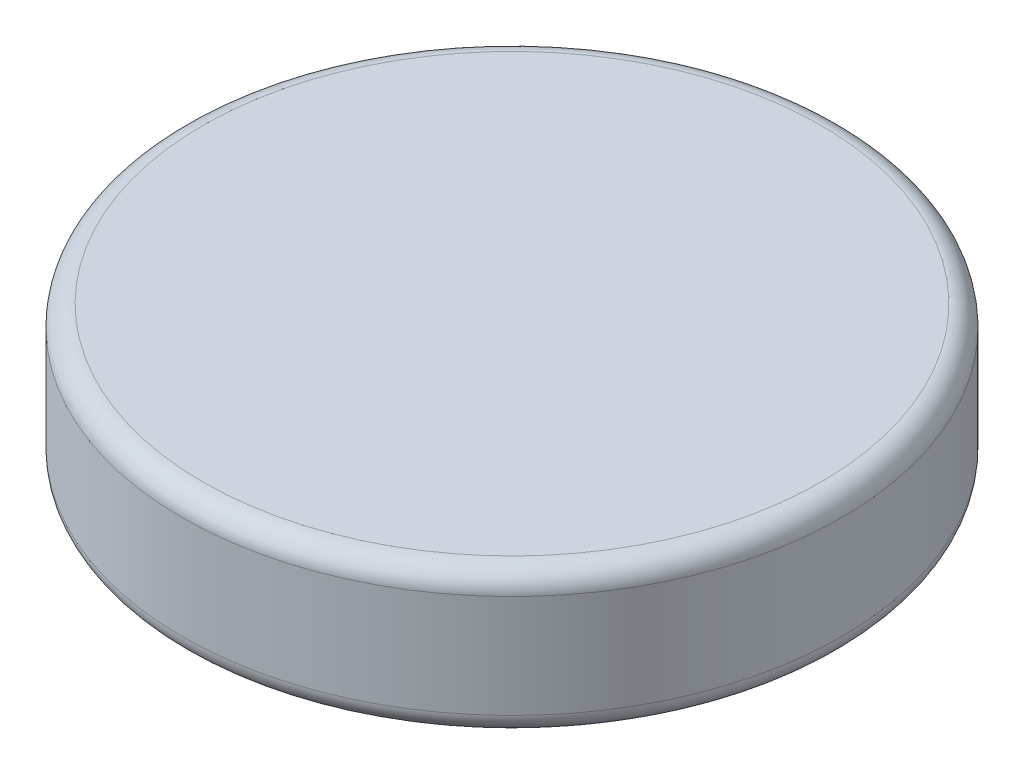
ISO-10303-21;
HEADER;
FILE_DESCRIPTION(('STEP AP214'),'2;1');
FILE_NAME('part.step','',(''),(''),'','','');
FILE_SCHEMA(('AUTOMOTIVE_DESIGN { 1 0 10303 214 1 1 1 1 }'));
ENDSEC;
DATA;
#1=APPLICATION_CONTEXT('core data for automotive mechanical design processes');
#2=APPLICATION_PROTOCOL_DEFINITION('international standard','automotive_design',2000,#1);
#3=PRODUCT_CONTEXT('',#1,'mechanical');
#4=PRODUCT('Part','Part','',(#3));
#5=PRODUCT_RELATED_PRODUCT_CATEGORY('part','',(#4));
#6=PRODUCT_DEFINITION_FORMATION('','',#4);
#7=PRODUCT_DEFINITION_CONTEXT('part definition',#1,'design');
#8=PRODUCT_DEFINITION('design','',#6,#7);
#9=PRODUCT_DEFINITION_SHAPE('','',#8);
#10=(LENGTH_UNIT() NAMED_UNIT(*) SI_UNIT(.MILLI.,.METRE.));
#11=(NAMED_UNIT(*) PLANE_ANGLE_UNIT() SI_UNIT($,.RADIAN.));
#12=(NAMED_UNIT(*) SI_UNIT($,.STERADIAN.) SOLID_ANGLE_UNIT());
#13=UNCERTAINTY_MEASURE_WITH_UNIT(LENGTH_MEASURE(1.E-05),#10,'distance_accuracy_value','');
#14=(GEOMETRIC_REPRESENTATION_CONTEXT(3) GLOBAL_UNCERTAINTY_ASSIGNED_CONTEXT((#13)) GLOBAL_UNIT_ASSIGNED_CONTEXT((#10,
#11,#12)) REPRESENTATION_CONTEXT('',''));
#15=CARTESIAN_POINT('',(0.,0.,0.));
#16=DIRECTION('',(0.,0.,1.));
#17=DIRECTION('',(1.,0.,0.));
#18=AXIS2_PLACEMENT_3D('',#15,#16,#17);
#19=CARTESIAN_POINT('',(0.,3.5,0.));
#20=DIRECTION('',(0.,-1.,0.));
#21=DIRECTION('',(0.,0.,-1.));
#22=AXIS2_PLACEMENT_3D('',#19,#20,#21);
#23=CYLINDRICAL_SURFACE('',#22,16.);
#24=CARTESIAN_POINT('',(0.,-2.5,0.));
#25=DIRECTION('',(0.,1.,0.));
#26=DIRECTION('',(0.,0.,1.));
#27=AXIS2_PLACEMENT_3D('',#24,#25,#26);
#28=CIRCLE('',#27,16.);
#29=CARTESIAN_POINT('',(0.,-2.5,16.));
#30=VERTEX_POINT('',#29);
#31=EDGE_CURVE('E43',#30,#30,#28,.T.);
#32=ORIENTED_EDGE('',*,*,#31,.T.);
#33=EDGE_LOOP('',(#32));
#34=FACE_BOUND('',#33,.T.);
#35=CARTESIAN_POINT('',(0.,2.5,0.));
#36=DIRECTION('',(0.,1.,0.));
#37=DIRECTION('',(0.,0.,1.));
#38=AXIS2_PLACEMENT_3D('',#35,#36,#37);
#39=CIRCLE('',#38,16.);
#40=CARTESIAN_POINT('',(0.,2.5,16.));
#41=VERTEX_POINT('',#40);
#42=EDGE_CURVE('E47',#41,#41,#39,.F.);
#43=ORIENTED_EDGE('',*,*,#42,.T.);
#44=EDGE_LOOP('',(#43));
#45=FACE_BOUND('',#44,.T.);
#46=ADVANCED_FACE('F32',(#34,#45),#23,.T.);
#47=CARTESIAN_POINT('',(0.,3.5,0.));
#48=DIRECTION('',(0.,1.,0.));
#49=DIRECTION('',(0.,0.,1.));
#50=AXIS2_PLACEMENT_3D('',#47,#48,#49);
#51=PLANE('',#50);
#52=CARTESIAN_POINT('',(0.,3.5,0.));
#53=DIRECTION('',(0.,1.,0.));
#54=DIRECTION('',(0.,0.,1.));
#55=AXIS2_PLACEMENT_3D('',#52,#53,#54);
#56=CIRCLE('',#55,15.);
#57=CARTESIAN_POINT('',(0.,3.5,15.));
#58=VERTEX_POINT('',#57);
#59=EDGE_CURVE('E10',#58,#58,#56,.T.);
#60=ORIENTED_EDGE('',*,*,#59,.T.);
#61=EDGE_LOOP('',(#60));
#62=FACE_BOUND('',#61,.T.);
#63=ADVANCED_FACE('F63',(#62),#51,.T.);
#64=CARTESIAN_POINT('',(0.,-3.5,0.));
#65=DIRECTION('',(0.,1.,0.));
#66=DIRECTION('',(0.,0.,1.));
#67=AXIS2_PLACEMENT_3D('',#64,#65,#66);
#68=PLANE('',#67);
#69=CARTESIAN_POINT('',(0.,-3.5,0.));
#70=DIRECTION('',(0.,1.,0.));
#71=DIRECTION('',(0.,0.,1.));
#72=AXIS2_PLACEMENT_3D('',#69,#70,#71);
#73=CIRCLE('',#72,15.);
#74=CARTESIAN_POINT('',(0.,-3.5,15.));
#75=VERTEX_POINT('',#74);
#76=EDGE_CURVE('E39',#75,#75,#73,.F.);
#77=ORIENTED_EDGE('',*,*,#76,.T.);
#78=EDGE_LOOP('',(#77));
#79=FACE_BOUND('',#78,.T.);
#80=ADVANCED_FACE('F60',(#79),#68,.F.);
#81=CARTESIAN_POINT('',(0.,-2.5,0.));
#82=DIRECTION('',(0.,1.,0.));
#83=DIRECTION('',(0.,0.,1.));
#84=AXIS2_PLACEMENT_3D('',#81,#82,#83);
#85=TOROIDAL_SURFACE('',#84,15.,1.);
#86=ORIENTED_EDGE('',*,*,#76,.F.);
#87=EDGE_LOOP('',(#86));
#88=FACE_BOUND('',#87,.T.);
#89=ORIENTED_EDGE('',*,*,#31,.F.);
#90=EDGE_LOOP('',(#89));
#91=FACE_BOUND('',#90,.T.);
#92=ADVANCED_FACE('F56',(#88,#91),#85,.T.);
#93=CARTESIAN_POINT('',(0.,2.5,0.));
#94=DIRECTION('',(0.,1.,0.));
#95=DIRECTION('',(0.,0.,1.));
#96=AXIS2_PLACEMENT_3D('',#93,#94,#95);
#97=TOROIDAL_SURFACE('',#96,15.,1.);
#98=ORIENTED_EDGE('',*,*,#42,.F.);
#99=EDGE_LOOP('',(#98));
#100=FACE_BOUND('',#99,.T.);
#101=ORIENTED_EDGE('',*,*,#59,.F.);
#102=EDGE_LOOP('',(#101));
#103=FACE_BOUND('',#102,.T.);
#104=ADVANCED_FACE('F34',(#100,#103),#97,.T.);
#105=CLOSED_SHELL('',(#46,#63,#80,#92,#104));
#106=MANIFOLD_SOLID_BREP('B2',#105);
#107=ADVANCED_BREP_SHAPE_REPRESENTATION('',(#18,#106),#14);
#108=SHAPE_DEFINITION_REPRESENTATION(#9,#107);
ENDSEC;
END-ISO-10303-21;
